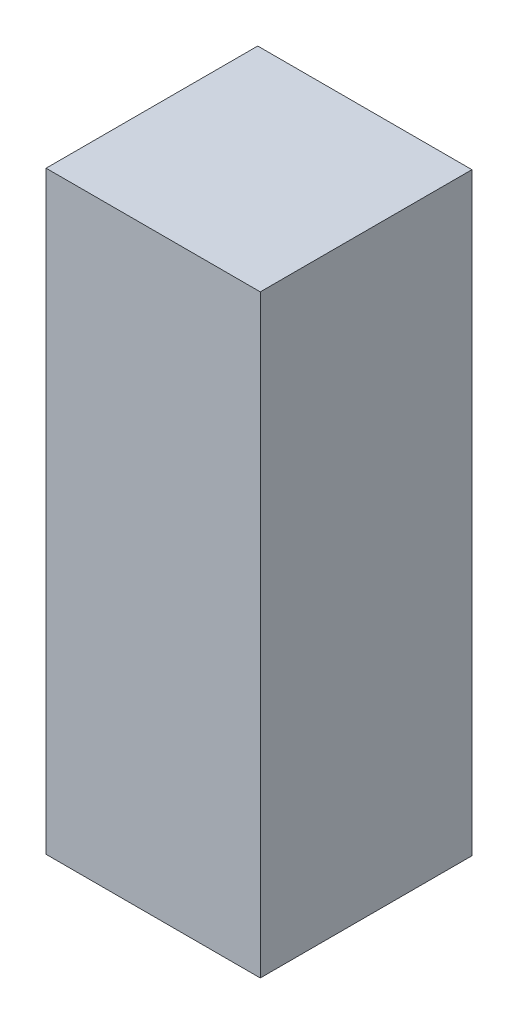
ISO-10303-21;
HEADER;
FILE_DESCRIPTION(('STEP AP214'),'2;1');
FILE_NAME('part.step','',(''),(''),'','','');
FILE_SCHEMA(('AUTOMOTIVE_DESIGN { 1 0 10303 214 1 1 1 1 }'));
ENDSEC;
DATA;
#1=APPLICATION_CONTEXT('core data for automotive mechanical design processes');
#2=APPLICATION_PROTOCOL_DEFINITION('international standard','automotive_design',2000,#1);
#3=PRODUCT_CONTEXT('',#1,'mechanical');
#4=PRODUCT('Part','Part','',(#3));
#5=PRODUCT_RELATED_PRODUCT_CATEGORY('part','',(#4));
#6=PRODUCT_DEFINITION_FORMATION('','',#4);
#7=PRODUCT_DEFINITION_CONTEXT('part definition',#1,'design');
#8=PRODUCT_DEFINITION('design','',#6,#7);
#9=PRODUCT_DEFINITION_SHAPE('','',#8);
#10=(LENGTH_UNIT() NAMED_UNIT(*) SI_UNIT(.MILLI.,.METRE.));
#11=(NAMED_UNIT(*) PLANE_ANGLE_UNIT() SI_UNIT($,.RADIAN.));
#12=(NAMED_UNIT(*) SI_UNIT($,.STERADIAN.) SOLID_ANGLE_UNIT());
#13=UNCERTAINTY_MEASURE_WITH_UNIT(LENGTH_MEASURE(1.E-05),#10,'distance_accuracy_value','');
#14=(GEOMETRIC_REPRESENTATION_CONTEXT(3) GLOBAL_UNCERTAINTY_ASSIGNED_CONTEXT((#13)) GLOBAL_UNIT_ASSIGNED_CONTEXT((#10,
#11,#12)) REPRESENTATION_CONTEXT('',''));
#15=CARTESIAN_POINT('',(0.,0.,0.));
#16=DIRECTION('',(0.,0.,1.));
#17=DIRECTION('',(1.,0.,0.));
#18=AXIS2_PLACEMENT_3D('',#15,#16,#17);
#19=CARTESIAN_POINT('',(10.16,28.1851835950481,15.2026247130824));
#20=DIRECTION('',(0.,0.,-1.));
#21=DIRECTION('',(-1.,0.,0.));
#22=AXIS2_PLACEMENT_3D('',#19,#20,#21);
#23=PLANE('',#22);
#24=DIRECTION('',(0.,-1.,0.));
#25=VECTOR('',#24,1.);
#26=CARTESIAN_POINT('',(0.,28.1851835950481,15.2026247130824));
#27=LINE('',#26,#25);
#28=CARTESIAN_POINT('',(0.,28.1851835950481,15.2026247130824));
#29=VERTEX_POINT('',#28);
#30=CARTESIAN_POINT('',(0.,0.,15.2026247130824));
#31=VERTEX_POINT('',#30);
#32=EDGE_CURVE('E95',#29,#31,#27,.T.);
#33=ORIENTED_EDGE('',*,*,#32,.T.);
#34=DIRECTION('',(-1.,0.,0.));
#35=VECTOR('',#34,1.);
#36=CARTESIAN_POINT('',(10.16,0.,15.2026247130824));
#37=LINE('',#36,#35);
#38=CARTESIAN_POINT('',(10.16,0.,15.2026247130824));
#39=VERTEX_POINT('',#38);
#40=EDGE_CURVE('E11',#39,#31,#37,.T.);
#41=ORIENTED_EDGE('',*,*,#40,.F.);
#42=DIRECTION('',(0.,-1.,0.));
#43=VECTOR('',#42,1.);
#44=CARTESIAN_POINT('',(10.16,28.1851835950481,15.2026247130824));
#45=LINE('',#44,#43);
#46=CARTESIAN_POINT('',(10.16,28.1851835950481,15.2026247130824));
#47=VERTEX_POINT('',#46);
#48=EDGE_CURVE('E83',#47,#39,#45,.T.);
#49=ORIENTED_EDGE('',*,*,#48,.F.);
#50=DIRECTION('',(-1.,0.,0.));
#51=VECTOR('',#50,1.);
#52=CARTESIAN_POINT('',(10.16,28.1851835950481,15.2026247130824));
#53=LINE('',#52,#51);
#54=EDGE_CURVE('E91',#47,#29,#53,.T.);
#55=ORIENTED_EDGE('',*,*,#54,.T.);
#56=EDGE_LOOP('',(#33,#41,#49,#55));
#57=FACE_BOUND('',#56,.T.);
#58=ADVANCED_FACE('F32',(#57),#23,.F.);
#59=CARTESIAN_POINT('',(10.16,0.,15.2026247130824));
#60=DIRECTION('',(0.,1.,0.));
#61=DIRECTION('',(0.,0.,1.));
#62=AXIS2_PLACEMENT_3D('',#59,#60,#61);
#63=PLANE('',#62);
#64=DIRECTION('',(0.,0.,-1.));
#65=VECTOR('',#64,1.);
#66=CARTESIAN_POINT('',(0.,0.,15.2026247130824));
#67=LINE('',#66,#65);
#68=CARTESIAN_POINT('',(0.,0.,5.16406617238038));
#69=VERTEX_POINT('',#68);
#70=EDGE_CURVE('E87',#31,#69,#67,.T.);
#71=ORIENTED_EDGE('',*,*,#70,.T.);
#72=DIRECTION('',(-1.,0.,0.));
#73=VECTOR('',#72,1.);
#74=CARTESIAN_POINT('',(10.16,0.,5.16406617238038));
#75=LINE('',#74,#73);
#76=CARTESIAN_POINT('',(10.16,0.,5.16406617238038));
#77=VERTEX_POINT('',#76);
#78=EDGE_CURVE('E40',#77,#69,#75,.T.);
#79=ORIENTED_EDGE('',*,*,#78,.F.);
#80=DIRECTION('',(0.,0.,-1.));
#81=VECTOR('',#80,1.);
#82=CARTESIAN_POINT('',(10.16,0.,15.2026247130824));
#83=LINE('',#82,#81);
#84=EDGE_CURVE('E78',#39,#77,#83,.T.);
#85=ORIENTED_EDGE('',*,*,#84,.F.);
#86=ORIENTED_EDGE('',*,*,#40,.T.);
#87=EDGE_LOOP('',(#71,#79,#85,#86));
#88=FACE_BOUND('',#87,.T.);
#89=ADVANCED_FACE('F86',(#88),#63,.F.);
#90=CARTESIAN_POINT('',(10.16,28.1851835950481,5.16406617238038));
#91=DIRECTION('',(0.,0.,1.));
#92=DIRECTION('',(1.,0.,0.));
#93=AXIS2_PLACEMENT_3D('',#90,#91,#92);
#94=PLANE('',#93);
#95=DIRECTION('',(0.,1.,0.));
#96=VECTOR('',#95,1.);
#97=CARTESIAN_POINT('',(0.,28.1851835950481,5.16406617238038));
#98=LINE('',#97,#96);
#99=CARTESIAN_POINT('',(0.,28.1851835950481,5.16406617238038));
#100=VERTEX_POINT('',#99);
#101=EDGE_CURVE('E65',#69,#100,#98,.T.);
#102=ORIENTED_EDGE('',*,*,#101,.T.);
#103=DIRECTION('',(-1.,0.,0.));
#104=VECTOR('',#103,1.);
#105=CARTESIAN_POINT('',(10.16,28.1851835950481,5.16406617238038));
#106=LINE('',#105,#104);
#107=CARTESIAN_POINT('',(10.16,28.1851835950481,5.16406617238038));
#108=VERTEX_POINT('',#107);
#109=EDGE_CURVE('E88',#108,#100,#106,.T.);
#110=ORIENTED_EDGE('',*,*,#109,.F.);
#111=DIRECTION('',(0.,1.,0.));
#112=VECTOR('',#111,1.);
#113=CARTESIAN_POINT('',(10.16,28.1851835950481,5.16406617238038));
#114=LINE('',#113,#112);
#115=EDGE_CURVE('E81',#77,#108,#114,.T.);
#116=ORIENTED_EDGE('',*,*,#115,.F.);
#117=ORIENTED_EDGE('',*,*,#78,.T.);
#118=EDGE_LOOP('',(#102,#110,#116,#117));
#119=FACE_BOUND('',#118,.T.);
#120=ADVANCED_FACE('F89',(#119),#94,.F.);
#121=CARTESIAN_POINT('',(10.16,28.1851835950481,15.2026247130824));
#122=DIRECTION('',(0.,-1.,0.));
#123=DIRECTION('',(0.,0.,-1.));
#124=AXIS2_PLACEMENT_3D('',#121,#122,#123);
#125=PLANE('',#124);
#126=DIRECTION('',(0.,0.,1.));
#127=VECTOR('',#126,1.);
#128=CARTESIAN_POINT('',(0.,28.1851835950481,15.2026247130824));
#129=LINE('',#128,#127);
#130=EDGE_CURVE('E71',#100,#29,#129,.T.);
#131=ORIENTED_EDGE('',*,*,#130,.T.);
#132=ORIENTED_EDGE('',*,*,#54,.F.);
#133=DIRECTION('',(0.,0.,1.));
#134=VECTOR('',#133,1.);
#135=CARTESIAN_POINT('',(10.16,28.1851835950481,15.2026247130824));
#136=LINE('',#135,#134);
#137=EDGE_CURVE('E48',#108,#47,#136,.T.);
#138=ORIENTED_EDGE('',*,*,#137,.F.);
#139=ORIENTED_EDGE('',*,*,#109,.T.);
#140=EDGE_LOOP('',(#131,#132,#138,#139));
#141=FACE_BOUND('',#140,.T.);
#142=ADVANCED_FACE('F102',(#141),#125,.F.);
#143=CARTESIAN_POINT('',(10.16,0.,0.));
#144=DIRECTION('',(1.,0.,0.));
#145=DIRECTION('',(0.,0.,-1.));
#146=AXIS2_PLACEMENT_3D('',#143,#144,#145);
#147=PLANE('',#146);
#148=ORIENTED_EDGE('',*,*,#48,.T.);
#149=ORIENTED_EDGE('',*,*,#84,.T.);
#150=ORIENTED_EDGE('',*,*,#115,.T.);
#151=ORIENTED_EDGE('',*,*,#137,.T.);
#152=EDGE_LOOP('',(#148,#149,#150,#151));
#153=FACE_BOUND('',#152,.T.);
#154=ADVANCED_FACE('F79',(#153),#147,.T.);
#155=CARTESIAN_POINT('',(0.,0.,0.));
#156=DIRECTION('',(1.,0.,0.));
#157=DIRECTION('',(0.,0.,-1.));
#158=AXIS2_PLACEMENT_3D('',#155,#156,#157);
#159=PLANE('',#158);
#160=ORIENTED_EDGE('',*,*,#32,.F.);
#161=ORIENTED_EDGE('',*,*,#130,.F.);
#162=ORIENTED_EDGE('',*,*,#101,.F.);
#163=ORIENTED_EDGE('',*,*,#70,.F.);
#164=EDGE_LOOP('',(#160,#161,#162,#163));
#165=FACE_BOUND('',#164,.T.);
#166=ADVANCED_FACE('F105',(#165),#159,.F.);
#167=CLOSED_SHELL('',(#58,#89,#120,#142,#154,#166));
#168=MANIFOLD_SOLID_BREP('B2',#167);
#169=ADVANCED_BREP_SHAPE_REPRESENTATION('',(#18,#168),#14);
#170=SHAPE_DEFINITION_REPRESENTATION(#9,#169);
ENDSEC;
END-ISO-10303-21;
